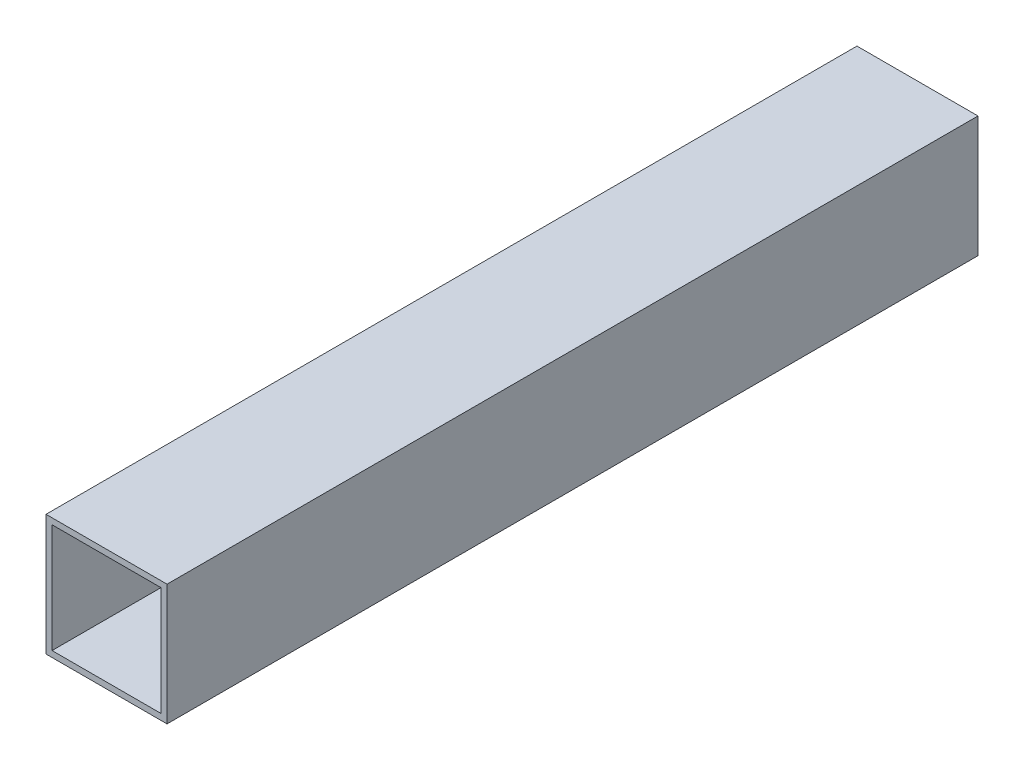
ISO-10303-21;
HEADER;
FILE_DESCRIPTION(('STEP AP214'),'2;1');
FILE_NAME('part.step','',(''),(''),'','','');
FILE_SCHEMA(('AUTOMOTIVE_DESIGN { 1 0 10303 214 1 1 1 1 }'));
ENDSEC;
DATA;
#1=APPLICATION_CONTEXT('core data for automotive mechanical design processes');
#2=APPLICATION_PROTOCOL_DEFINITION('international standard','automotive_design',2000,#1);
#3=PRODUCT_CONTEXT('',#1,'mechanical');
#4=PRODUCT('Part','Part','',(#3));
#5=PRODUCT_RELATED_PRODUCT_CATEGORY('part','',(#4));
#6=PRODUCT_DEFINITION_FORMATION('','',#4);
#7=PRODUCT_DEFINITION_CONTEXT('part definition',#1,'design');
#8=PRODUCT_DEFINITION('design','',#6,#7);
#9=PRODUCT_DEFINITION_SHAPE('','',#8);
#10=(LENGTH_UNIT() NAMED_UNIT(*) SI_UNIT(.MILLI.,.METRE.));
#11=(NAMED_UNIT(*) PLANE_ANGLE_UNIT() SI_UNIT($,.RADIAN.));
#12=(NAMED_UNIT(*) SI_UNIT($,.STERADIAN.) SOLID_ANGLE_UNIT());
#13=UNCERTAINTY_MEASURE_WITH_UNIT(LENGTH_MEASURE(1.E-05),#10,'distance_accuracy_value','');
#14=(GEOMETRIC_REPRESENTATION_CONTEXT(3) GLOBAL_UNCERTAINTY_ASSIGNED_CONTEXT((#13)) GLOBAL_UNIT_ASSIGNED_CONTEXT((#10,
#11,#12)) REPRESENTATION_CONTEXT('',''));
#15=CARTESIAN_POINT('',(0.,0.,0.));
#16=DIRECTION('',(0.,0.,1.));
#17=DIRECTION('',(1.,0.,0.));
#18=AXIS2_PLACEMENT_3D('',#15,#16,#17);
#19=CARTESIAN_POINT('',(-20.,-20.,268.));
#20=DIRECTION('',(0.,0.,1.));
#21=DIRECTION('',(1.,0.,0.));
#22=AXIS2_PLACEMENT_3D('',#19,#20,#21);
#23=PLANE('',#22);
#24=DIRECTION('',(0.,-1.,0.));
#25=VECTOR('',#24,1.);
#26=CARTESIAN_POINT('',(-20.,-20.,268.));
#27=LINE('',#26,#25);
#28=CARTESIAN_POINT('',(-20.,20.,268.));
#29=VERTEX_POINT('',#28);
#30=CARTESIAN_POINT('',(-20.,-20.,268.));
#31=VERTEX_POINT('',#30);
#32=EDGE_CURVE('E155',#29,#31,#27,.T.);
#33=ORIENTED_EDGE('',*,*,#32,.T.);
#34=DIRECTION('',(1.,0.,0.));
#35=VECTOR('',#34,1.);
#36=CARTESIAN_POINT('',(20.,-20.,268.));
#37=LINE('',#36,#35);
#38=CARTESIAN_POINT('',(20.,-20.,268.));
#39=VERTEX_POINT('',#38);
#40=EDGE_CURVE('E158',#31,#39,#37,.T.);
#41=ORIENTED_EDGE('',*,*,#40,.T.);
#42=DIRECTION('',(0.,1.,0.));
#43=VECTOR('',#42,1.);
#44=CARTESIAN_POINT('',(20.,-20.,268.));
#45=LINE('',#44,#43);
#46=CARTESIAN_POINT('',(20.,20.,268.));
#47=VERTEX_POINT('',#46);
#48=EDGE_CURVE('E161',#39,#47,#45,.T.);
#49=ORIENTED_EDGE('',*,*,#48,.T.);
#50=DIRECTION('',(-1.,0.,0.));
#51=VECTOR('',#50,1.);
#52=CARTESIAN_POINT('',(20.,20.,268.));
#53=LINE('',#52,#51);
#54=EDGE_CURVE('E163',#47,#29,#53,.T.);
#55=ORIENTED_EDGE('',*,*,#54,.T.);
#56=EDGE_LOOP('',(#33,#41,#49,#55));
#57=FACE_BOUND('',#56,.T.);
#58=DIRECTION('',(1.,0.,0.));
#59=VECTOR('',#58,1.);
#60=CARTESIAN_POINT('',(20.,-18.,268.));
#61=LINE('',#60,#59);
#62=CARTESIAN_POINT('',(-18.,-18.,268.));
#63=VERTEX_POINT('',#62);
#64=CARTESIAN_POINT('',(18.,-18.,268.));
#65=VERTEX_POINT('',#64);
#66=EDGE_CURVE('E127',#63,#65,#61,.T.);
#67=ORIENTED_EDGE('',*,*,#66,.F.);
#68=DIRECTION('',(0.,-1.,0.));
#69=VECTOR('',#68,1.);
#70=CARTESIAN_POINT('',(-18.,-20.,268.));
#71=LINE('',#70,#69);
#72=CARTESIAN_POINT('',(-18.,18.,268.));
#73=VERTEX_POINT('',#72);
#74=EDGE_CURVE('E119',#73,#63,#71,.T.);
#75=ORIENTED_EDGE('',*,*,#74,.F.);
#76=DIRECTION('',(-1.,0.,0.));
#77=VECTOR('',#76,1.);
#78=CARTESIAN_POINT('',(20.,18.,268.));
#79=LINE('',#78,#77);
#80=CARTESIAN_POINT('',(18.,18.,268.));
#81=VERTEX_POINT('',#80);
#82=EDGE_CURVE('E141',#81,#73,#79,.T.);
#83=ORIENTED_EDGE('',*,*,#82,.F.);
#84=DIRECTION('',(0.,1.,0.));
#85=VECTOR('',#84,1.);
#86=CARTESIAN_POINT('',(18.,-20.,268.));
#87=LINE('',#86,#85);
#88=EDGE_CURVE('E139',#65,#81,#87,.T.);
#89=ORIENTED_EDGE('',*,*,#88,.F.);
#90=EDGE_LOOP('',(#67,#75,#83,#89));
#91=FACE_BOUND('',#90,.T.);
#92=ADVANCED_FACE('F54',(#57,#91),#23,.T.);
#93=CARTESIAN_POINT('',(-20.,-20.,0.));
#94=DIRECTION('',(0.,0.,1.));
#95=DIRECTION('',(1.,0.,0.));
#96=AXIS2_PLACEMENT_3D('',#93,#94,#95);
#97=PLANE('',#96);
#98=DIRECTION('',(0.,-1.,0.));
#99=VECTOR('',#98,1.);
#100=CARTESIAN_POINT('',(-20.,-20.,0.));
#101=LINE('',#100,#99);
#102=CARTESIAN_POINT('',(-20.,20.,0.));
#103=VERTEX_POINT('',#102);
#104=CARTESIAN_POINT('',(-20.,-20.,0.));
#105=VERTEX_POINT('',#104);
#106=EDGE_CURVE('E135',#103,#105,#101,.T.);
#107=ORIENTED_EDGE('',*,*,#106,.F.);
#108=DIRECTION('',(-1.,0.,0.));
#109=VECTOR('',#108,1.);
#110=CARTESIAN_POINT('',(20.,20.,0.));
#111=LINE('',#110,#109);
#112=CARTESIAN_POINT('',(20.,20.,0.));
#113=VERTEX_POINT('',#112);
#114=EDGE_CURVE('E159',#113,#103,#111,.T.);
#115=ORIENTED_EDGE('',*,*,#114,.F.);
#116=DIRECTION('',(0.,1.,0.));
#117=VECTOR('',#116,1.);
#118=CARTESIAN_POINT('',(20.,-20.,0.));
#119=LINE('',#118,#117);
#120=CARTESIAN_POINT('',(20.,-20.,0.));
#121=VERTEX_POINT('',#120);
#122=EDGE_CURVE('E170',#121,#113,#119,.T.);
#123=ORIENTED_EDGE('',*,*,#122,.F.);
#124=DIRECTION('',(1.,0.,0.));
#125=VECTOR('',#124,1.);
#126=CARTESIAN_POINT('',(20.,-20.,0.));
#127=LINE('',#126,#125);
#128=EDGE_CURVE('E168',#105,#121,#127,.T.);
#129=ORIENTED_EDGE('',*,*,#128,.F.);
#130=EDGE_LOOP('',(#107,#115,#123,#129));
#131=FACE_BOUND('',#130,.T.);
#132=DIRECTION('',(0.,-1.,0.));
#133=VECTOR('',#132,1.);
#134=CARTESIAN_POINT('',(-18.,-20.,0.));
#135=LINE('',#134,#133);
#136=CARTESIAN_POINT('',(-18.,18.,0.));
#137=VERTEX_POINT('',#136);
#138=CARTESIAN_POINT('',(-18.,-18.,0.));
#139=VERTEX_POINT('',#138);
#140=EDGE_CURVE('E77',#137,#139,#135,.T.);
#141=ORIENTED_EDGE('',*,*,#140,.T.);
#142=DIRECTION('',(1.,0.,0.));
#143=VECTOR('',#142,1.);
#144=CARTESIAN_POINT('',(20.,-18.,0.));
#145=LINE('',#144,#143);
#146=CARTESIAN_POINT('',(18.,-18.,0.));
#147=VERTEX_POINT('',#146);
#148=EDGE_CURVE('E134',#139,#147,#145,.T.);
#149=ORIENTED_EDGE('',*,*,#148,.T.);
#150=DIRECTION('',(0.,1.,0.));
#151=VECTOR('',#150,1.);
#152=CARTESIAN_POINT('',(18.,-20.,0.));
#153=LINE('',#152,#151);
#154=CARTESIAN_POINT('',(18.,18.,0.));
#155=VERTEX_POINT('',#154);
#156=EDGE_CURVE('E147',#147,#155,#153,.T.);
#157=ORIENTED_EDGE('',*,*,#156,.T.);
#158=DIRECTION('',(-1.,0.,0.));
#159=VECTOR('',#158,1.);
#160=CARTESIAN_POINT('',(20.,18.,0.));
#161=LINE('',#160,#159);
#162=EDGE_CURVE('E128',#155,#137,#161,.T.);
#163=ORIENTED_EDGE('',*,*,#162,.T.);
#164=EDGE_LOOP('',(#141,#149,#157,#163));
#165=FACE_BOUND('',#164,.T.);
#166=ADVANCED_FACE('F188',(#131,#165),#97,.F.);
#167=CARTESIAN_POINT('',(-20.,-20.,268.));
#168=DIRECTION('',(1.,0.,0.));
#169=DIRECTION('',(0.,0.,-1.));
#170=AXIS2_PLACEMENT_3D('',#167,#168,#169);
#171=PLANE('',#170);
#172=ORIENTED_EDGE('',*,*,#106,.T.);
#173=DIRECTION('',(0.,0.,-1.));
#174=VECTOR('',#173,1.);
#175=CARTESIAN_POINT('',(-20.,-20.,268.));
#176=LINE('',#175,#174);
#177=EDGE_CURVE('E12',#31,#105,#176,.T.);
#178=ORIENTED_EDGE('',*,*,#177,.F.);
#179=ORIENTED_EDGE('',*,*,#32,.F.);
#180=DIRECTION('',(0.,0.,-1.));
#181=VECTOR('',#180,1.);
#182=CARTESIAN_POINT('',(-20.,20.,268.));
#183=LINE('',#182,#181);
#184=EDGE_CURVE('E165',#29,#103,#183,.T.);
#185=ORIENTED_EDGE('',*,*,#184,.T.);
#186=EDGE_LOOP('',(#172,#178,#179,#185));
#187=FACE_BOUND('',#186,.T.);
#188=ADVANCED_FACE('F56',(#187),#171,.F.);
#189=CARTESIAN_POINT('',(20.,-20.,268.));
#190=DIRECTION('',(0.,1.,0.));
#191=DIRECTION('',(-1.,0.,0.));
#192=AXIS2_PLACEMENT_3D('',#189,#190,#191);
#193=PLANE('',#192);
#194=ORIENTED_EDGE('',*,*,#128,.T.);
#195=DIRECTION('',(0.,0.,-1.));
#196=VECTOR('',#195,1.);
#197=CARTESIAN_POINT('',(20.,-20.,268.));
#198=LINE('',#197,#196);
#199=EDGE_CURVE('E62',#39,#121,#198,.T.);
#200=ORIENTED_EDGE('',*,*,#199,.F.);
#201=ORIENTED_EDGE('',*,*,#40,.F.);
#202=ORIENTED_EDGE('',*,*,#177,.T.);
#203=EDGE_LOOP('',(#194,#200,#201,#202));
#204=FACE_BOUND('',#203,.T.);
#205=ADVANCED_FACE('F198',(#204),#193,.F.);
#206=CARTESIAN_POINT('',(20.,-20.,268.));
#207=DIRECTION('',(-1.,0.,0.));
#208=DIRECTION('',(0.,0.,1.));
#209=AXIS2_PLACEMENT_3D('',#206,#207,#208);
#210=PLANE('',#209);
#211=ORIENTED_EDGE('',*,*,#122,.T.);
#212=DIRECTION('',(0.,0.,-1.));
#213=VECTOR('',#212,1.);
#214=CARTESIAN_POINT('',(20.,20.,268.));
#215=LINE('',#214,#213);
#216=EDGE_CURVE('E175',#47,#113,#215,.T.);
#217=ORIENTED_EDGE('',*,*,#216,.F.);
#218=ORIENTED_EDGE('',*,*,#48,.F.);
#219=ORIENTED_EDGE('',*,*,#199,.T.);
#220=EDGE_LOOP('',(#211,#217,#218,#219));
#221=FACE_BOUND('',#220,.T.);
#222=ADVANCED_FACE('F182',(#221),#210,.F.);
#223=CARTESIAN_POINT('',(20.,20.,268.));
#224=DIRECTION('',(0.,-1.,0.));
#225=DIRECTION('',(1.,0.,0.));
#226=AXIS2_PLACEMENT_3D('',#223,#224,#225);
#227=PLANE('',#226);
#228=ORIENTED_EDGE('',*,*,#114,.T.);
#229=ORIENTED_EDGE('',*,*,#184,.F.);
#230=ORIENTED_EDGE('',*,*,#54,.F.);
#231=ORIENTED_EDGE('',*,*,#216,.T.);
#232=EDGE_LOOP('',(#228,#229,#230,#231));
#233=FACE_BOUND('',#232,.T.);
#234=ADVANCED_FACE('F192',(#233),#227,.F.);
#235=CARTESIAN_POINT('',(-18.,-20.,268.));
#236=DIRECTION('',(1.,0.,0.));
#237=DIRECTION('',(0.,0.,-1.));
#238=AXIS2_PLACEMENT_3D('',#235,#236,#237);
#239=PLANE('',#238);
#240=ORIENTED_EDGE('',*,*,#140,.F.);
#241=DIRECTION('',(0.,0.,-1.));
#242=VECTOR('',#241,1.);
#243=CARTESIAN_POINT('',(-18.,18.,268.));
#244=LINE('',#243,#242);
#245=EDGE_CURVE('E123',#73,#137,#244,.T.);
#246=ORIENTED_EDGE('',*,*,#245,.F.);
#247=ORIENTED_EDGE('',*,*,#74,.T.);
#248=DIRECTION('',(0.,0.,-1.));
#249=VECTOR('',#248,1.);
#250=CARTESIAN_POINT('',(-18.,-18.,268.));
#251=LINE('',#250,#249);
#252=EDGE_CURVE('E122',#63,#139,#251,.T.);
#253=ORIENTED_EDGE('',*,*,#252,.T.);
#254=EDGE_LOOP('',(#240,#246,#247,#253));
#255=FACE_BOUND('',#254,.T.);
#256=ADVANCED_FACE('F121',(#255),#239,.T.);
#257=CARTESIAN_POINT('',(20.,-18.,268.));
#258=DIRECTION('',(0.,1.,0.));
#259=DIRECTION('',(-1.,0.,0.));
#260=AXIS2_PLACEMENT_3D('',#257,#258,#259);
#261=PLANE('',#260);
#262=ORIENTED_EDGE('',*,*,#148,.F.);
#263=ORIENTED_EDGE('',*,*,#252,.F.);
#264=ORIENTED_EDGE('',*,*,#66,.T.);
#265=DIRECTION('',(0.,0.,-1.));
#266=VECTOR('',#265,1.);
#267=CARTESIAN_POINT('',(18.,-18.,268.));
#268=LINE('',#267,#266);
#269=EDGE_CURVE('E136',#65,#147,#268,.T.);
#270=ORIENTED_EDGE('',*,*,#269,.T.);
#271=EDGE_LOOP('',(#262,#263,#264,#270));
#272=FACE_BOUND('',#271,.T.);
#273=ADVANCED_FACE('F131',(#272),#261,.T.);
#274=CARTESIAN_POINT('',(18.,-20.,268.));
#275=DIRECTION('',(-1.,0.,0.));
#276=DIRECTION('',(0.,0.,1.));
#277=AXIS2_PLACEMENT_3D('',#274,#275,#276);
#278=PLANE('',#277);
#279=ORIENTED_EDGE('',*,*,#156,.F.);
#280=ORIENTED_EDGE('',*,*,#269,.F.);
#281=ORIENTED_EDGE('',*,*,#88,.T.);
#282=DIRECTION('',(0.,0.,-1.));
#283=VECTOR('',#282,1.);
#284=CARTESIAN_POINT('',(18.,18.,268.));
#285=LINE('',#284,#283);
#286=EDGE_CURVE('E69',#81,#155,#285,.T.);
#287=ORIENTED_EDGE('',*,*,#286,.T.);
#288=EDGE_LOOP('',(#279,#280,#281,#287));
#289=FACE_BOUND('',#288,.T.);
#290=ADVANCED_FACE('F221',(#289),#278,.T.);
#291=CARTESIAN_POINT('',(20.,18.,268.));
#292=DIRECTION('',(0.,-1.,0.));
#293=DIRECTION('',(1.,0.,0.));
#294=AXIS2_PLACEMENT_3D('',#291,#292,#293);
#295=PLANE('',#294);
#296=ORIENTED_EDGE('',*,*,#162,.F.);
#297=ORIENTED_EDGE('',*,*,#286,.F.);
#298=ORIENTED_EDGE('',*,*,#82,.T.);
#299=ORIENTED_EDGE('',*,*,#245,.T.);
#300=EDGE_LOOP('',(#296,#297,#298,#299));
#301=FACE_BOUND('',#300,.T.);
#302=ADVANCED_FACE('F225',(#301),#295,.T.);
#303=CLOSED_SHELL('',(#92,#166,#188,#205,#222,#234,#256,#273,#290,#302));
#304=MANIFOLD_SOLID_BREP('B2',#303);
#305=ADVANCED_BREP_SHAPE_REPRESENTATION('',(#18,#304),#14);
#306=SHAPE_DEFINITION_REPRESENTATION(#9,#305);
ENDSEC;
END-ISO-10303-21;
